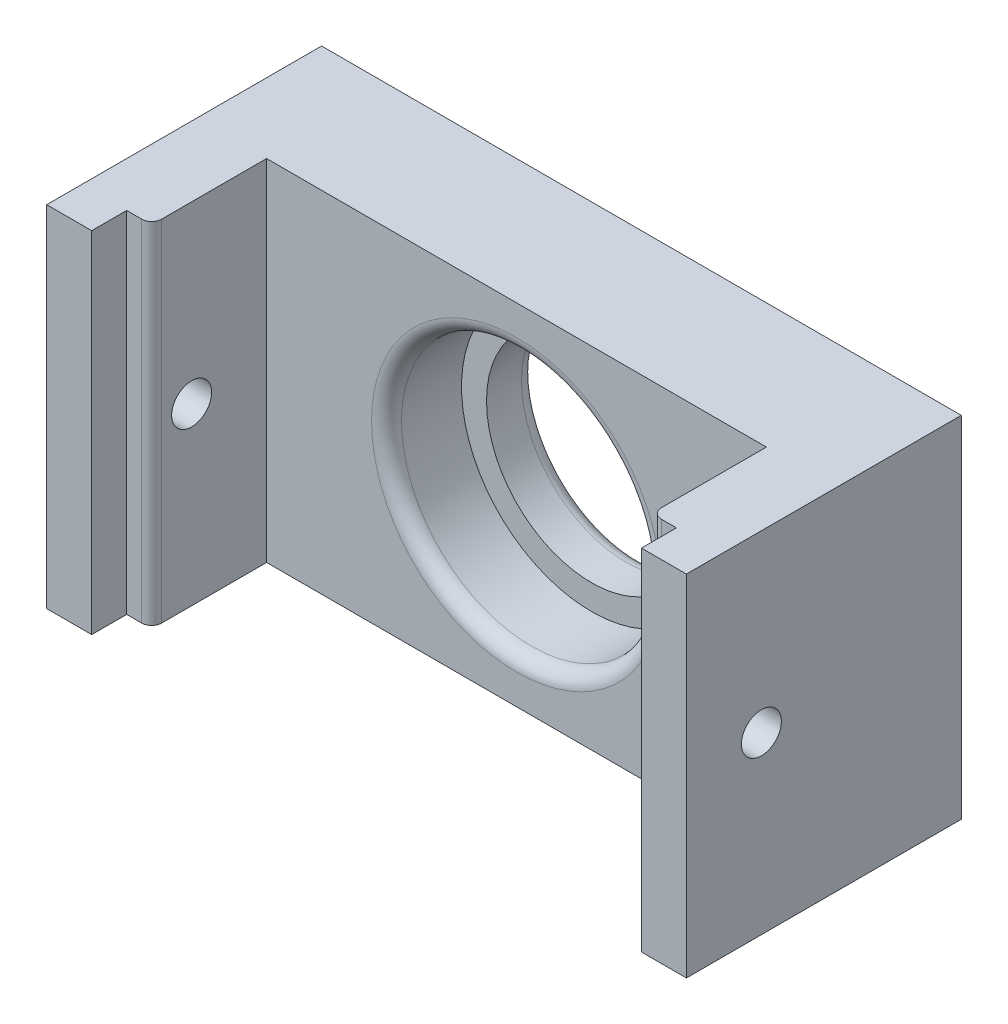
ISO-10303-21;
HEADER;
FILE_DESCRIPTION(('STEP AP214'),'2;1');
FILE_NAME('part.step','',(''),(''),'','','');
FILE_SCHEMA(('AUTOMOTIVE_DESIGN { 1 0 10303 214 1 1 1 1 }'));
ENDSEC;
DATA;
#1=APPLICATION_CONTEXT('core data for automotive mechanical design processes');
#2=APPLICATION_PROTOCOL_DEFINITION('international standard','automotive_design',2000,#1);
#3=PRODUCT_CONTEXT('',#1,'mechanical');
#4=PRODUCT('Part','Part','',(#3));
#5=PRODUCT_RELATED_PRODUCT_CATEGORY('part','',(#4));
#6=PRODUCT_DEFINITION_FORMATION('','',#4);
#7=PRODUCT_DEFINITION_CONTEXT('part definition',#1,'design');
#8=PRODUCT_DEFINITION('design','',#6,#7);
#9=PRODUCT_DEFINITION_SHAPE('','',#8);
#10=(LENGTH_UNIT() NAMED_UNIT(*) SI_UNIT(.MILLI.,.METRE.));
#11=(NAMED_UNIT(*) PLANE_ANGLE_UNIT() SI_UNIT($,.RADIAN.));
#12=(NAMED_UNIT(*) SI_UNIT($,.STERADIAN.) SOLID_ANGLE_UNIT());
#13=UNCERTAINTY_MEASURE_WITH_UNIT(LENGTH_MEASURE(1.E-05),#10,'distance_accuracy_value','');
#14=(GEOMETRIC_REPRESENTATION_CONTEXT(3) GLOBAL_UNCERTAINTY_ASSIGNED_CONTEXT((#13)) GLOBAL_UNIT_ASSIGNED_CONTEXT((#10,
#11,#12)) REPRESENTATION_CONTEXT('',''));
#15=CARTESIAN_POINT('',(0.,0.,0.));
#16=DIRECTION('',(0.,0.,1.));
#17=DIRECTION('',(1.,0.,0.));
#18=AXIS2_PLACEMENT_3D('',#15,#16,#17);
#19=CARTESIAN_POINT('',(25.,17.5,27.5));
#20=DIRECTION('',(1.,0.,0.));
#21=DIRECTION('',(0.,1.,0.));
#22=AXIS2_PLACEMENT_3D('',#19,#20,#21);
#23=PLANE('',#22);
#24=CARTESIAN_POINT('',(25.,0.,20.));
#25=DIRECTION('',(-1.,0.,0.));
#26=DIRECTION('',(0.,-1.,0.));
#27=AXIS2_PLACEMENT_3D('',#24,#25,#26);
#28=CIRCLE('',#27,2.);
#29=CARTESIAN_POINT('',(25.,-1.99999999999999,20.));
#30=VERTEX_POINT('',#29);
#31=EDGE_CURVE('E200',#30,#30,#28,.T.);
#32=ORIENTED_EDGE('',*,*,#31,.F.);
#33=EDGE_LOOP('',(#32));
#34=FACE_BOUND('',#33,.T.);
#35=DIRECTION('',(0.,0.,-1.));
#36=VECTOR('',#35,1.);
#37=CARTESIAN_POINT('',(25.,-17.5,27.5));
#38=LINE('',#37,#36);
#39=CARTESIAN_POINT('',(25.,-17.5,23.));
#40=VERTEX_POINT('',#39);
#41=CARTESIAN_POINT('',(25.,-17.5,12.5));
#42=VERTEX_POINT('',#41);
#43=EDGE_CURVE('E214',#40,#42,#38,.T.);
#44=ORIENTED_EDGE('',*,*,#43,.F.);
#45=DIRECTION('',(0.,-1.,0.));
#46=VECTOR('',#45,1.);
#47=CARTESIAN_POINT('',(25.,17.5,23.));
#48=LINE('',#47,#46);
#49=CARTESIAN_POINT('',(25.,17.5,23.));
#50=VERTEX_POINT('',#49);
#51=EDGE_CURVE('E322',#40,#50,#48,.F.);
#52=ORIENTED_EDGE('',*,*,#51,.T.);
#53=DIRECTION('',(0.,0.,-1.));
#54=VECTOR('',#53,1.);
#55=CARTESIAN_POINT('',(25.,17.5,27.5));
#56=LINE('',#55,#54);
#57=CARTESIAN_POINT('',(25.,17.5,12.5));
#58=VERTEX_POINT('',#57);
#59=EDGE_CURVE('E208',#50,#58,#56,.T.);
#60=ORIENTED_EDGE('',*,*,#59,.T.);
#61=DIRECTION('',(0.,-1.,0.));
#62=VECTOR('',#61,1.);
#63=CARTESIAN_POINT('',(25.,17.5,12.5));
#64=LINE('',#63,#62);
#65=EDGE_CURVE('E218',#58,#42,#64,.T.);
#66=ORIENTED_EDGE('',*,*,#65,.T.);
#67=EDGE_LOOP('',(#44,#52,#60,#66));
#68=FACE_BOUND('',#67,.T.);
#69=ADVANCED_FACE('F42',(#34,#68),#23,.F.);
#70=CARTESIAN_POINT('',(0.,0.,12.5));
#71=DIRECTION('',(0.,0.,1.));
#72=DIRECTION('',(1.,0.,0.));
#73=AXIS2_PLACEMENT_3D('',#70,#71,#72);
#74=PLANE('',#73);
#75=CARTESIAN_POINT('',(0.,0.,12.5));
#76=DIRECTION('',(0.,0.,1.));
#77=DIRECTION('',(1.,0.,0.));
#78=AXIS2_PLACEMENT_3D('',#75,#76,#77);
#79=CIRCLE('',#78,14.5);
#80=CARTESIAN_POINT('',(14.5,0.,12.5));
#81=VERTEX_POINT('',#80);
#82=EDGE_CURVE('E300',#81,#81,#79,.F.);
#83=ORIENTED_EDGE('',*,*,#82,.T.);
#84=EDGE_LOOP('',(#83));
#85=FACE_BOUND('',#84,.T.);
#86=DIRECTION('',(1.,0.,0.));
#87=VECTOR('',#86,1.);
#88=CARTESIAN_POINT('',(0.,-17.5,12.5));
#89=LINE('',#88,#87);
#90=CARTESIAN_POINT('',(-25.,-17.5,12.5));
#91=VERTEX_POINT('',#90);
#92=EDGE_CURVE('E261',#91,#42,#89,.T.);
#93=ORIENTED_EDGE('',*,*,#92,.T.);
#94=ORIENTED_EDGE('',*,*,#65,.F.);
#95=DIRECTION('',(1.,0.,0.));
#96=VECTOR('',#95,1.);
#97=CARTESIAN_POINT('',(0.,17.5,12.5));
#98=LINE('',#97,#96);
#99=CARTESIAN_POINT('',(-25.,17.5,12.5));
#100=VERTEX_POINT('',#99);
#101=EDGE_CURVE('E257',#100,#58,#98,.T.);
#102=ORIENTED_EDGE('',*,*,#101,.F.);
#103=DIRECTION('',(0.,1.,0.));
#104=VECTOR('',#103,1.);
#105=CARTESIAN_POINT('',(-25.,17.5,12.5));
#106=LINE('',#105,#104);
#107=EDGE_CURVE('E222',#91,#100,#106,.T.);
#108=ORIENTED_EDGE('',*,*,#107,.F.);
#109=EDGE_LOOP('',(#93,#94,#102,#108));
#110=FACE_BOUND('',#109,.T.);
#111=ADVANCED_FACE('F349',(#85,#110),#74,.T.);
#112=CARTESIAN_POINT('',(0.,0.,12.5));
#113=DIRECTION('',(0.,0.,-1.));
#114=DIRECTION('',(-1.,0.,0.));
#115=AXIS2_PLACEMENT_3D('',#112,#113,#114);
#116=CYLINDRICAL_SURFACE('',#115,10.5);
#117=CARTESIAN_POINT('',(0.,0.,1.5));
#118=DIRECTION('',(0.,0.,1.));
#119=DIRECTION('',(1.,0.,0.));
#120=AXIS2_PLACEMENT_3D('',#117,#118,#119);
#121=CIRCLE('',#120,10.5);
#122=CARTESIAN_POINT('',(10.5,0.,1.5));
#123=VERTEX_POINT('',#122);
#124=EDGE_CURVE('E308',#123,#123,#121,.F.);
#125=ORIENTED_EDGE('',*,*,#124,.T.);
#126=EDGE_LOOP('',(#125));
#127=FACE_BOUND('',#126,.T.);
#128=CARTESIAN_POINT('',(0.,0.,5.));
#129=DIRECTION('',(0.,0.,1.));
#130=DIRECTION('',(1.,0.,0.));
#131=AXIS2_PLACEMENT_3D('',#128,#129,#130);
#132=CIRCLE('',#131,10.5);
#133=CARTESIAN_POINT('',(10.5,0.,5.));
#134=VERTEX_POINT('',#133);
#135=EDGE_CURVE('E256',#134,#134,#132,.T.);
#136=ORIENTED_EDGE('',*,*,#135,.T.);
#137=EDGE_LOOP('',(#136));
#138=FACE_BOUND('',#137,.T.);
#139=ADVANCED_FACE('F400',(#127,#138),#116,.F.);
#140=CARTESIAN_POINT('',(32.,0.,12.5));
#141=DIRECTION('',(1.,0.,0.));
#142=DIRECTION('',(0.,0.,-1.));
#143=AXIS2_PLACEMENT_3D('',#140,#141,#142);
#144=PLANE('',#143);
#145=CARTESIAN_POINT('',(32.,0.,20.));
#146=DIRECTION('',(-1.,0.,0.));
#147=DIRECTION('',(0.,-1.,0.));
#148=AXIS2_PLACEMENT_3D('',#145,#146,#147);
#149=CIRCLE('',#148,2.);
#150=CARTESIAN_POINT('',(32.,-1.99999999999999,20.));
#151=VERTEX_POINT('',#150);
#152=EDGE_CURVE('E204',#151,#151,#149,.T.);
#153=ORIENTED_EDGE('',*,*,#152,.T.);
#154=EDGE_LOOP('',(#153));
#155=FACE_BOUND('',#154,.T.);
#156=DIRECTION('',(0.,-1.,0.));
#157=VECTOR('',#156,1.);
#158=CARTESIAN_POINT('',(32.,0.,0.));
#159=LINE('',#158,#157);
#160=CARTESIAN_POINT('',(32.,17.5,0.));
#161=VERTEX_POINT('',#160);
#162=CARTESIAN_POINT('',(32.,-17.5,0.));
#163=VERTEX_POINT('',#162);
#164=EDGE_CURVE('E267',#161,#163,#159,.T.);
#165=ORIENTED_EDGE('',*,*,#164,.F.);
#166=DIRECTION('',(0.,0.,-1.));
#167=VECTOR('',#166,1.);
#168=CARTESIAN_POINT('',(32.,17.5,12.5));
#169=LINE('',#168,#167);
#170=CARTESIAN_POINT('',(32.,17.5,27.5));
#171=VERTEX_POINT('',#170);
#172=EDGE_CURVE('E290',#171,#161,#169,.T.);
#173=ORIENTED_EDGE('',*,*,#172,.F.);
#174=DIRECTION('',(0.,1.,0.));
#175=VECTOR('',#174,1.);
#176=CARTESIAN_POINT('',(32.,17.5,27.5));
#177=LINE('',#176,#175);
#178=CARTESIAN_POINT('',(32.,-17.5,27.5));
#179=VERTEX_POINT('',#178);
#180=EDGE_CURVE('E223',#179,#171,#177,.T.);
#181=ORIENTED_EDGE('',*,*,#180,.F.);
#182=DIRECTION('',(0.,0.,-1.));
#183=VECTOR('',#182,1.);
#184=CARTESIAN_POINT('',(32.,-17.5,12.5));
#185=LINE('',#184,#183);
#186=EDGE_CURVE('E266',#179,#163,#185,.T.);
#187=ORIENTED_EDGE('',*,*,#186,.T.);
#188=EDGE_LOOP('',(#165,#173,#181,#187));
#189=FACE_BOUND('',#188,.T.);
#190=ADVANCED_FACE('F369',(#155,#189),#144,.T.);
#191=CARTESIAN_POINT('',(0.,17.5,12.5));
#192=DIRECTION('',(0.,1.,0.));
#193=DIRECTION('',(0.,0.,1.));
#194=AXIS2_PLACEMENT_3D('',#191,#192,#193);
#195=PLANE('',#194);
#196=ORIENTED_EDGE('',*,*,#59,.F.);
#197=CARTESIAN_POINT('',(26.,17.5,23.));
#198=DIRECTION('',(0.,1.,0.));
#199=DIRECTION('',(0.,0.,1.));
#200=AXIS2_PLACEMENT_3D('',#197,#198,#199);
#201=CIRCLE('',#200,1.);
#202=CARTESIAN_POINT('',(26.,17.5,24.));
#203=VERTEX_POINT('',#202);
#204=EDGE_CURVE('E327',#50,#203,#201,.T.);
#205=ORIENTED_EDGE('',*,*,#204,.T.);
#206=DIRECTION('',(-1.,0.,0.));
#207=VECTOR('',#206,1.);
#208=CARTESIAN_POINT('',(25.,17.5,24.));
#209=LINE('',#208,#207);
#210=CARTESIAN_POINT('',(27.5,17.5,24.));
#211=VERTEX_POINT('',#210);
#212=EDGE_CURVE('E178',#211,#203,#209,.T.);
#213=ORIENTED_EDGE('',*,*,#212,.F.);
#214=DIRECTION('',(0.,0.,1.));
#215=VECTOR('',#214,1.);
#216=CARTESIAN_POINT('',(27.5,17.5,24.));
#217=LINE('',#216,#215);
#218=CARTESIAN_POINT('',(27.5,17.5,27.5));
#219=VERTEX_POINT('',#218);
#220=EDGE_CURVE('E179',#211,#219,#217,.T.);
#221=ORIENTED_EDGE('',*,*,#220,.T.);
#222=DIRECTION('',(-1.,0.,0.));
#223=VECTOR('',#222,1.);
#224=CARTESIAN_POINT('',(32.,17.5,27.5));
#225=LINE('',#224,#223);
#226=EDGE_CURVE('E226',#171,#219,#225,.T.);
#227=ORIENTED_EDGE('',*,*,#226,.F.);
#228=ORIENTED_EDGE('',*,*,#172,.T.);
#229=DIRECTION('',(1.,0.,0.));
#230=VECTOR('',#229,1.);
#231=CARTESIAN_POINT('',(0.,17.5,0.));
#232=LINE('',#231,#230);
#233=CARTESIAN_POINT('',(-32.,17.5,0.));
#234=VERTEX_POINT('',#233);
#235=EDGE_CURVE('E271',#234,#161,#232,.T.);
#236=ORIENTED_EDGE('',*,*,#235,.F.);
#237=DIRECTION('',(0.,0.,-1.));
#238=VECTOR('',#237,1.);
#239=CARTESIAN_POINT('',(-32.,17.5,12.5));
#240=LINE('',#239,#238);
#241=CARTESIAN_POINT('',(-32.,17.5,27.5));
#242=VERTEX_POINT('',#241);
#243=EDGE_CURVE('E287',#242,#234,#240,.T.);
#244=ORIENTED_EDGE('',*,*,#243,.F.);
#245=DIRECTION('',(-1.,0.,0.));
#246=VECTOR('',#245,1.);
#247=CARTESIAN_POINT('',(-32.,17.5,27.5));
#248=LINE('',#247,#246);
#249=CARTESIAN_POINT('',(-27.5,17.5,27.5));
#250=VERTEX_POINT('',#249);
#251=EDGE_CURVE('E165',#250,#242,#248,.T.);
#252=ORIENTED_EDGE('',*,*,#251,.F.);
#253=DIRECTION('',(0.,0.,1.));
#254=VECTOR('',#253,1.);
#255=CARTESIAN_POINT('',(-27.5,17.5,24.));
#256=LINE('',#255,#254);
#257=CARTESIAN_POINT('',(-27.5,17.5,24.));
#258=VERTEX_POINT('',#257);
#259=EDGE_CURVE('E154',#258,#250,#256,.T.);
#260=ORIENTED_EDGE('',*,*,#259,.F.);
#261=DIRECTION('',(-1.,0.,0.));
#262=VECTOR('',#261,1.);
#263=CARTESIAN_POINT('',(-25.,17.5,24.));
#264=LINE('',#263,#262);
#265=CARTESIAN_POINT('',(-26.,17.5,24.));
#266=VERTEX_POINT('',#265);
#267=EDGE_CURVE('E142',#266,#258,#264,.T.);
#268=ORIENTED_EDGE('',*,*,#267,.F.);
#269=CARTESIAN_POINT('',(-26.,17.5,23.));
#270=DIRECTION('',(0.,1.,0.));
#271=DIRECTION('',(0.,0.,1.));
#272=AXIS2_PLACEMENT_3D('',#269,#270,#271);
#273=CIRCLE('',#272,1.);
#274=CARTESIAN_POINT('',(-25.,17.5,23.));
#275=VERTEX_POINT('',#274);
#276=EDGE_CURVE('E58',#266,#275,#273,.T.);
#277=ORIENTED_EDGE('',*,*,#276,.T.);
#278=DIRECTION('',(0.,0.,-1.));
#279=VECTOR('',#278,1.);
#280=CARTESIAN_POINT('',(-25.,17.5,27.5));
#281=LINE('',#280,#279);
#282=EDGE_CURVE('E243',#275,#100,#281,.T.);
#283=ORIENTED_EDGE('',*,*,#282,.T.);
#284=ORIENTED_EDGE('',*,*,#101,.T.);
#285=EDGE_LOOP('',(#196,#205,#213,#221,#227,#228,#236,#244,#252,#260,#268,#277,#283,#284));
#286=FACE_BOUND('',#285,.T.);
#287=ADVANCED_FACE('F163',(#286),#195,.T.);
#288=CARTESIAN_POINT('',(-32.,0.,12.5));
#289=DIRECTION('',(1.,0.,0.));
#290=DIRECTION('',(0.,0.,-1.));
#291=AXIS2_PLACEMENT_3D('',#288,#289,#290);
#292=PLANE('',#291);
#293=CARTESIAN_POINT('',(-32.,0.,20.));
#294=DIRECTION('',(1.,0.,0.));
#295=DIRECTION('',(0.,1.,0.));
#296=AXIS2_PLACEMENT_3D('',#293,#294,#295);
#297=CIRCLE('',#296,2.);
#298=CARTESIAN_POINT('',(-32.,2.,20.));
#299=VERTEX_POINT('',#298);
#300=EDGE_CURVE('E196',#299,#299,#297,.T.);
#301=ORIENTED_EDGE('',*,*,#300,.T.);
#302=EDGE_LOOP('',(#301));
#303=FACE_BOUND('',#302,.T.);
#304=DIRECTION('',(0.,-1.,0.));
#305=VECTOR('',#304,1.);
#306=CARTESIAN_POINT('',(-32.,0.,0.));
#307=LINE('',#306,#305);
#308=CARTESIAN_POINT('',(-32.,-17.5,0.));
#309=VERTEX_POINT('',#308);
#310=EDGE_CURVE('E275',#234,#309,#307,.T.);
#311=ORIENTED_EDGE('',*,*,#310,.T.);
#312=DIRECTION('',(0.,0.,-1.));
#313=VECTOR('',#312,1.);
#314=CARTESIAN_POINT('',(-32.,-17.5,12.5));
#315=LINE('',#314,#313);
#316=CARTESIAN_POINT('',(-32.,-17.5,27.5));
#317=VERTEX_POINT('',#316);
#318=EDGE_CURVE('E283',#317,#309,#315,.T.);
#319=ORIENTED_EDGE('',*,*,#318,.F.);
#320=DIRECTION('',(0.,-1.,0.));
#321=VECTOR('',#320,1.);
#322=CARTESIAN_POINT('',(-32.,17.5,27.5));
#323=LINE('',#322,#321);
#324=EDGE_CURVE('E233',#242,#317,#323,.T.);
#325=ORIENTED_EDGE('',*,*,#324,.F.);
#326=ORIENTED_EDGE('',*,*,#243,.T.);
#327=EDGE_LOOP('',(#311,#319,#325,#326));
#328=FACE_BOUND('',#327,.T.);
#329=ADVANCED_FACE('F360',(#303,#328),#292,.F.);
#330=CARTESIAN_POINT('',(0.,-17.5,12.5));
#331=DIRECTION('',(0.,1.,0.));
#332=DIRECTION('',(0.,0.,1.));
#333=AXIS2_PLACEMENT_3D('',#330,#331,#332);
#334=PLANE('',#333);
#335=DIRECTION('',(1.,0.,0.));
#336=VECTOR('',#335,1.);
#337=CARTESIAN_POINT('',(25.,-17.5,24.));
#338=LINE('',#337,#336);
#339=CARTESIAN_POINT('',(26.,-17.5,24.));
#340=VERTEX_POINT('',#339);
#341=CARTESIAN_POINT('',(27.5,-17.5,24.));
#342=VERTEX_POINT('',#341);
#343=EDGE_CURVE('E186',#340,#342,#338,.T.);
#344=ORIENTED_EDGE('',*,*,#343,.F.);
#345=CARTESIAN_POINT('',(26.,-17.5,23.));
#346=DIRECTION('',(0.,1.,0.));
#347=DIRECTION('',(0.,0.,1.));
#348=AXIS2_PLACEMENT_3D('',#345,#346,#347);
#349=CIRCLE('',#348,1.);
#350=EDGE_CURVE('E319',#340,#40,#349,.F.);
#351=ORIENTED_EDGE('',*,*,#350,.T.);
#352=ORIENTED_EDGE('',*,*,#43,.T.);
#353=ORIENTED_EDGE('',*,*,#92,.F.);
#354=DIRECTION('',(0.,0.,-1.));
#355=VECTOR('',#354,1.);
#356=CARTESIAN_POINT('',(-25.,-17.5,27.5));
#357=LINE('',#356,#355);
#358=CARTESIAN_POINT('',(-25.,-17.5,23.));
#359=VERTEX_POINT('',#358);
#360=EDGE_CURVE('E249',#359,#91,#357,.T.);
#361=ORIENTED_EDGE('',*,*,#360,.F.);
#362=CARTESIAN_POINT('',(-26.,-17.5,23.));
#363=DIRECTION('',(0.,1.,0.));
#364=DIRECTION('',(0.,0.,1.));
#365=AXIS2_PLACEMENT_3D('',#362,#363,#364);
#366=CIRCLE('',#365,1.);
#367=CARTESIAN_POINT('',(-26.,-17.5,24.));
#368=VERTEX_POINT('',#367);
#369=EDGE_CURVE('E316',#359,#368,#366,.F.);
#370=ORIENTED_EDGE('',*,*,#369,.T.);
#371=DIRECTION('',(1.,0.,0.));
#372=VECTOR('',#371,1.);
#373=CARTESIAN_POINT('',(-25.,-17.5,24.));
#374=LINE('',#373,#372);
#375=CARTESIAN_POINT('',(-27.5,-17.5,24.));
#376=VERTEX_POINT('',#375);
#377=EDGE_CURVE('E159',#376,#368,#374,.T.);
#378=ORIENTED_EDGE('',*,*,#377,.F.);
#379=DIRECTION('',(0.,0.,1.));
#380=VECTOR('',#379,1.);
#381=CARTESIAN_POINT('',(-27.5,-17.5,24.));
#382=LINE('',#381,#380);
#383=CARTESIAN_POINT('',(-27.5,-17.5,27.5));
#384=VERTEX_POINT('',#383);
#385=EDGE_CURVE('E157',#376,#384,#382,.T.);
#386=ORIENTED_EDGE('',*,*,#385,.T.);
#387=DIRECTION('',(1.,0.,0.));
#388=VECTOR('',#387,1.);
#389=CARTESIAN_POINT('',(-32.,-17.5,27.5));
#390=LINE('',#389,#388);
#391=EDGE_CURVE('E237',#317,#384,#390,.T.);
#392=ORIENTED_EDGE('',*,*,#391,.F.);
#393=ORIENTED_EDGE('',*,*,#318,.T.);
#394=DIRECTION('',(1.,0.,0.));
#395=VECTOR('',#394,1.);
#396=CARTESIAN_POINT('',(0.,-17.5,0.));
#397=LINE('',#396,#395);
#398=EDGE_CURVE('E262',#309,#163,#397,.T.);
#399=ORIENTED_EDGE('',*,*,#398,.T.);
#400=ORIENTED_EDGE('',*,*,#186,.F.);
#401=DIRECTION('',(1.,0.,0.));
#402=VECTOR('',#401,1.);
#403=CARTESIAN_POINT('',(32.,-17.5,27.5));
#404=LINE('',#403,#402);
#405=CARTESIAN_POINT('',(27.5,-17.5,27.5));
#406=VERTEX_POINT('',#405);
#407=EDGE_CURVE('E217',#406,#179,#404,.T.);
#408=ORIENTED_EDGE('',*,*,#407,.F.);
#409=DIRECTION('',(0.,0.,1.));
#410=VECTOR('',#409,1.);
#411=CARTESIAN_POINT('',(27.5,-17.5,24.));
#412=LINE('',#411,#410);
#413=EDGE_CURVE('E175',#342,#406,#412,.T.);
#414=ORIENTED_EDGE('',*,*,#413,.F.);
#415=EDGE_LOOP('',(#344,#351,#352,#353,#361,#370,#378,#386,#392,#393,#399,#400,#408,#414));
#416=FACE_BOUND('',#415,.T.);
#417=ADVANCED_FACE('F342',(#416),#334,.F.);
#418=CARTESIAN_POINT('',(0.,0.,0.));
#419=DIRECTION('',(0.,0.,1.));
#420=DIRECTION('',(1.,0.,0.));
#421=AXIS2_PLACEMENT_3D('',#418,#419,#420);
#422=PLANE('',#421);
#423=CARTESIAN_POINT('',(0.,0.,0.));
#424=DIRECTION('',(0.,0.,1.));
#425=DIRECTION('',(1.,0.,0.));
#426=AXIS2_PLACEMENT_3D('',#423,#424,#425);
#427=CIRCLE('',#426,12.);
#428=CARTESIAN_POINT('',(12.,0.,0.));
#429=VERTEX_POINT('',#428);
#430=EDGE_CURVE('E304',#429,#429,#427,.T.);
#431=ORIENTED_EDGE('',*,*,#430,.T.);
#432=EDGE_LOOP('',(#431));
#433=FACE_BOUND('',#432,.T.);
#434=ORIENTED_EDGE('',*,*,#164,.T.);
#435=ORIENTED_EDGE('',*,*,#398,.F.);
#436=ORIENTED_EDGE('',*,*,#310,.F.);
#437=ORIENTED_EDGE('',*,*,#235,.T.);
#438=EDGE_LOOP('',(#434,#435,#436,#437));
#439=FACE_BOUND('',#438,.T.);
#440=ADVANCED_FACE('F365',(#433,#439),#422,.F.);
#441=CARTESIAN_POINT('',(0.,0.,5.));
#442=DIRECTION('',(0.,0.,1.));
#443=DIRECTION('',(1.,0.,0.));
#444=AXIS2_PLACEMENT_3D('',#441,#442,#443);
#445=CYLINDRICAL_SURFACE('',#444,13.);
#446=CARTESIAN_POINT('',(0.,0.,11.));
#447=DIRECTION('',(0.,0.,1.));
#448=DIRECTION('',(1.,0.,0.));
#449=AXIS2_PLACEMENT_3D('',#446,#447,#448);
#450=CIRCLE('',#449,13.);
#451=CARTESIAN_POINT('',(13.,0.,11.));
#452=VERTEX_POINT('',#451);
#453=EDGE_CURVE('E293',#452,#452,#450,.T.);
#454=ORIENTED_EDGE('',*,*,#453,.T.);
#455=EDGE_LOOP('',(#454));
#456=FACE_BOUND('',#455,.T.);
#457=CARTESIAN_POINT('',(0.,0.,5.));
#458=DIRECTION('',(0.,0.,1.));
#459=DIRECTION('',(1.,0.,0.));
#460=AXIS2_PLACEMENT_3D('',#457,#458,#459);
#461=CIRCLE('',#460,13.);
#462=CARTESIAN_POINT('',(13.,0.,5.));
#463=VERTEX_POINT('',#462);
#464=EDGE_CURVE('E252',#463,#463,#461,.T.);
#465=ORIENTED_EDGE('',*,*,#464,.F.);
#466=EDGE_LOOP('',(#465));
#467=FACE_BOUND('',#466,.T.);
#468=ADVANCED_FACE('F418',(#456,#467),#445,.F.);
#469=CARTESIAN_POINT('',(0.,0.,5.));
#470=DIRECTION('',(0.,0.,1.));
#471=DIRECTION('',(1.,0.,0.));
#472=AXIS2_PLACEMENT_3D('',#469,#470,#471);
#473=PLANE('',#472);
#474=ORIENTED_EDGE('',*,*,#135,.F.);
#475=EDGE_LOOP('',(#474));
#476=FACE_BOUND('',#475,.T.);
#477=ORIENTED_EDGE('',*,*,#464,.T.);
#478=EDGE_LOOP('',(#477));
#479=FACE_BOUND('',#478,.T.);
#480=ADVANCED_FACE('F414',(#476,#479),#473,.T.);
#481=CARTESIAN_POINT('',(-25.,17.5,27.5));
#482=DIRECTION('',(-1.,0.,0.));
#483=DIRECTION('',(0.,-1.,0.));
#484=AXIS2_PLACEMENT_3D('',#481,#482,#483);
#485=PLANE('',#484);
#486=CARTESIAN_POINT('',(-25.,0.,20.));
#487=DIRECTION('',(1.,0.,0.));
#488=DIRECTION('',(0.,1.,0.));
#489=AXIS2_PLACEMENT_3D('',#486,#487,#488);
#490=CIRCLE('',#489,2.);
#491=CARTESIAN_POINT('',(-25.,2.,20.));
#492=VERTEX_POINT('',#491);
#493=EDGE_CURVE('E170',#492,#492,#490,.T.);
#494=ORIENTED_EDGE('',*,*,#493,.F.);
#495=EDGE_LOOP('',(#494));
#496=FACE_BOUND('',#495,.T.);
#497=ORIENTED_EDGE('',*,*,#282,.F.);
#498=DIRECTION('',(0.,1.,0.));
#499=VECTOR('',#498,1.);
#500=CARTESIAN_POINT('',(-25.,17.5,23.));
#501=LINE('',#500,#499);
#502=EDGE_CURVE('E11',#275,#359,#501,.F.);
#503=ORIENTED_EDGE('',*,*,#502,.T.);
#504=ORIENTED_EDGE('',*,*,#360,.T.);
#505=ORIENTED_EDGE('',*,*,#107,.T.);
#506=EDGE_LOOP('',(#497,#503,#504,#505));
#507=FACE_BOUND('',#506,.T.);
#508=ADVANCED_FACE('F352',(#496,#507),#485,.F.);
#509=CARTESIAN_POINT('',(0.,0.,27.5));
#510=DIRECTION('',(0.,0.,1.));
#511=DIRECTION('',(1.,0.,0.));
#512=AXIS2_PLACEMENT_3D('',#509,#510,#511);
#513=PLANE('',#512);
#514=DIRECTION('',(0.,-1.,0.));
#515=VECTOR('',#514,1.);
#516=CARTESIAN_POINT('',(-27.5,17.5,27.5));
#517=LINE('',#516,#515);
#518=EDGE_CURVE('E150',#250,#384,#517,.T.);
#519=ORIENTED_EDGE('',*,*,#518,.F.);
#520=ORIENTED_EDGE('',*,*,#251,.T.);
#521=ORIENTED_EDGE('',*,*,#324,.T.);
#522=ORIENTED_EDGE('',*,*,#391,.T.);
#523=EDGE_LOOP('',(#519,#520,#521,#522));
#524=FACE_BOUND('',#523,.T.);
#525=ADVANCED_FACE('F357',(#524),#513,.T.);
#526=CARTESIAN_POINT('',(0.,0.,27.5));
#527=DIRECTION('',(0.,0.,-1.));
#528=DIRECTION('',(-1.,0.,0.));
#529=AXIS2_PLACEMENT_3D('',#526,#527,#528);
#530=PLANE('',#529);
#531=ORIENTED_EDGE('',*,*,#226,.T.);
#532=DIRECTION('',(0.,1.,0.));
#533=VECTOR('',#532,1.);
#534=CARTESIAN_POINT('',(27.5,17.5,27.5));
#535=LINE('',#534,#533);
#536=EDGE_CURVE('E183',#406,#219,#535,.T.);
#537=ORIENTED_EDGE('',*,*,#536,.F.);
#538=ORIENTED_EDGE('',*,*,#407,.T.);
#539=ORIENTED_EDGE('',*,*,#180,.T.);
#540=EDGE_LOOP('',(#531,#537,#538,#539));
#541=FACE_BOUND('',#540,.T.);
#542=ADVANCED_FACE('F375',(#541),#530,.F.);
#543=CARTESIAN_POINT('',(32.,0.,20.));
#544=DIRECTION('',(-1.,0.,0.));
#545=DIRECTION('',(0.,-1.,0.));
#546=AXIS2_PLACEMENT_3D('',#543,#544,#545);
#547=CYLINDRICAL_SURFACE('',#546,2.);
#548=ORIENTED_EDGE('',*,*,#152,.F.);
#549=EDGE_LOOP('',(#548));
#550=FACE_BOUND('',#549,.T.);
#551=ORIENTED_EDGE('',*,*,#31,.T.);
#552=EDGE_LOOP('',(#551));
#553=FACE_BOUND('',#552,.T.);
#554=ADVANCED_FACE('F406',(#550,#553),#547,.F.);
#555=CARTESIAN_POINT('',(-32.,0.,20.));
#556=DIRECTION('',(1.,0.,0.));
#557=DIRECTION('',(0.,1.,0.));
#558=AXIS2_PLACEMENT_3D('',#555,#556,#557);
#559=CYLINDRICAL_SURFACE('',#558,2.);
#560=ORIENTED_EDGE('',*,*,#300,.F.);
#561=EDGE_LOOP('',(#560));
#562=FACE_BOUND('',#561,.T.);
#563=ORIENTED_EDGE('',*,*,#493,.T.);
#564=EDGE_LOOP('',(#563));
#565=FACE_BOUND('',#564,.T.);
#566=ADVANCED_FACE('F439',(#562,#565),#559,.F.);
#567=CARTESIAN_POINT('',(0.,0.,11.));
#568=DIRECTION('',(0.,0.,1.));
#569=DIRECTION('',(1.,0.,0.));
#570=AXIS2_PLACEMENT_3D('',#567,#568,#569);
#571=TOROIDAL_SURFACE('',#570,14.5,1.5);
#572=ORIENTED_EDGE('',*,*,#82,.F.);
#573=EDGE_LOOP('',(#572));
#574=FACE_BOUND('',#573,.T.);
#575=ORIENTED_EDGE('',*,*,#453,.F.);
#576=EDGE_LOOP('',(#575));
#577=FACE_BOUND('',#576,.T.);
#578=ADVANCED_FACE('F388',(#574,#577),#571,.T.);
#579=CARTESIAN_POINT('',(0.,0.,1.5));
#580=DIRECTION('',(0.,0.,1.));
#581=DIRECTION('',(1.,0.,0.));
#582=AXIS2_PLACEMENT_3D('',#579,#580,#581);
#583=TOROIDAL_SURFACE('',#582,12.,1.5);
#584=ORIENTED_EDGE('',*,*,#124,.F.);
#585=EDGE_LOOP('',(#584));
#586=FACE_BOUND('',#585,.T.);
#587=ORIENTED_EDGE('',*,*,#430,.F.);
#588=EDGE_LOOP('',(#587));
#589=FACE_BOUND('',#588,.T.);
#590=ADVANCED_FACE('F379',(#586,#589),#583,.T.);
#591=CARTESIAN_POINT('',(27.5,17.5,24.));
#592=DIRECTION('',(1.,0.,0.));
#593=DIRECTION('',(0.,1.,0.));
#594=AXIS2_PLACEMENT_3D('',#591,#592,#593);
#595=PLANE('',#594);
#596=ORIENTED_EDGE('',*,*,#536,.T.);
#597=ORIENTED_EDGE('',*,*,#220,.F.);
#598=DIRECTION('',(0.,1.,0.));
#599=VECTOR('',#598,1.);
#600=CARTESIAN_POINT('',(27.5,17.5,24.));
#601=LINE('',#600,#599);
#602=EDGE_CURVE('E190',#342,#211,#601,.T.);
#603=ORIENTED_EDGE('',*,*,#602,.F.);
#604=ORIENTED_EDGE('',*,*,#413,.T.);
#605=EDGE_LOOP('',(#596,#597,#603,#604));
#606=FACE_BOUND('',#605,.T.);
#607=ADVANCED_FACE('F377',(#606),#595,.F.);
#608=CARTESIAN_POINT('',(0.,0.,24.));
#609=DIRECTION('',(0.,0.,1.));
#610=DIRECTION('',(1.,0.,0.));
#611=AXIS2_PLACEMENT_3D('',#608,#609,#610);
#612=PLANE('',#611);
#613=ORIENTED_EDGE('',*,*,#212,.T.);
#614=DIRECTION('',(0.,-1.,0.));
#615=VECTOR('',#614,1.);
#616=CARTESIAN_POINT('',(26.,-17.5,24.));
#617=LINE('',#616,#615);
#618=EDGE_CURVE('E312',#203,#340,#617,.T.);
#619=ORIENTED_EDGE('',*,*,#618,.T.);
#620=ORIENTED_EDGE('',*,*,#343,.T.);
#621=ORIENTED_EDGE('',*,*,#602,.T.);
#622=EDGE_LOOP('',(#613,#619,#620,#621));
#623=FACE_BOUND('',#622,.T.);
#624=ADVANCED_FACE('F336',(#623),#612,.T.);
#625=CARTESIAN_POINT('',(-27.5,17.5,24.));
#626=DIRECTION('',(-1.,0.,0.));
#627=DIRECTION('',(0.,-1.,0.));
#628=AXIS2_PLACEMENT_3D('',#625,#626,#627);
#629=PLANE('',#628);
#630=ORIENTED_EDGE('',*,*,#518,.T.);
#631=ORIENTED_EDGE('',*,*,#385,.F.);
#632=DIRECTION('',(0.,-1.,0.));
#633=VECTOR('',#632,1.);
#634=CARTESIAN_POINT('',(-27.5,17.5,24.));
#635=LINE('',#634,#633);
#636=EDGE_CURVE('E146',#258,#376,#635,.T.);
#637=ORIENTED_EDGE('',*,*,#636,.F.);
#638=ORIENTED_EDGE('',*,*,#259,.T.);
#639=EDGE_LOOP('',(#630,#631,#637,#638));
#640=FACE_BOUND('',#639,.T.);
#641=ADVANCED_FACE('F153',(#640),#629,.F.);
#642=CARTESIAN_POINT('',(0.,0.,24.));
#643=DIRECTION('',(0.,0.,-1.));
#644=DIRECTION('',(-1.,0.,0.));
#645=AXIS2_PLACEMENT_3D('',#642,#643,#644);
#646=PLANE('',#645);
#647=ORIENTED_EDGE('',*,*,#377,.T.);
#648=DIRECTION('',(0.,1.,0.));
#649=VECTOR('',#648,1.);
#650=CARTESIAN_POINT('',(-26.,0.,24.));
#651=LINE('',#650,#649);
#652=EDGE_CURVE('E51',#368,#266,#651,.T.);
#653=ORIENTED_EDGE('',*,*,#652,.T.);
#654=ORIENTED_EDGE('',*,*,#267,.T.);
#655=ORIENTED_EDGE('',*,*,#636,.T.);
#656=EDGE_LOOP('',(#647,#653,#654,#655));
#657=FACE_BOUND('',#656,.T.);
#658=ADVANCED_FACE('F145',(#657),#646,.F.);
#659=CARTESIAN_POINT('',(26.,0.,23.));
#660=DIRECTION('',(0.,1.,0.));
#661=DIRECTION('',(-1.,0.,0.));
#662=AXIS2_PLACEMENT_3D('',#659,#660,#661);
#663=CYLINDRICAL_SURFACE('',#662,1.);
#664=ORIENTED_EDGE('',*,*,#204,.F.);
#665=ORIENTED_EDGE('',*,*,#51,.F.);
#666=ORIENTED_EDGE('',*,*,#350,.F.);
#667=ORIENTED_EDGE('',*,*,#618,.F.);
#668=EDGE_LOOP('',(#664,#665,#666,#667));
#669=FACE_BOUND('',#668,.T.);
#670=ADVANCED_FACE('F339',(#669),#663,.T.);
#671=CARTESIAN_POINT('',(-26.,0.,23.));
#672=DIRECTION('',(0.,1.,0.));
#673=DIRECTION('',(-1.,0.,0.));
#674=AXIS2_PLACEMENT_3D('',#671,#672,#673);
#675=CYLINDRICAL_SURFACE('',#674,1.);
#676=ORIENTED_EDGE('',*,*,#369,.F.);
#677=ORIENTED_EDGE('',*,*,#502,.F.);
#678=ORIENTED_EDGE('',*,*,#276,.F.);
#679=ORIENTED_EDGE('',*,*,#652,.F.);
#680=EDGE_LOOP('',(#676,#677,#678,#679));
#681=FACE_BOUND('',#680,.T.);
#682=ADVANCED_FACE('F44',(#681),#675,.T.);
#683=CLOSED_SHELL('',(#69,#111,#139,#190,#287,#329,#417,#440,#468,#480,#508,#525,#542,#554,#566,
#578,#590,#607,#624,#641,#658,#670,#682));
#684=MANIFOLD_SOLID_BREP('B2',#683);
#685=ADVANCED_BREP_SHAPE_REPRESENTATION('',(#18,#684),#14);
#686=SHAPE_DEFINITION_REPRESENTATION(#9,#685);
ENDSEC;
END-ISO-10303-21;
